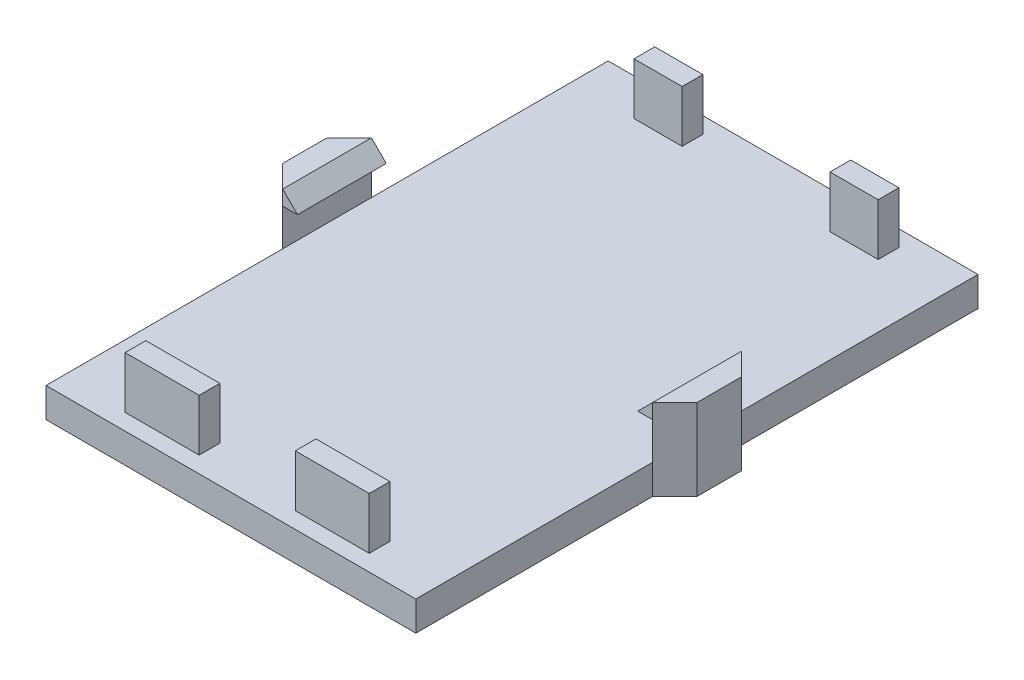
ISO-10303-21;
HEADER;
FILE_DESCRIPTION(('STEP AP214'),'2;1');
FILE_NAME('part.step','',(''),(''),'','','');
FILE_SCHEMA(('AUTOMOTIVE_DESIGN { 1 0 10303 214 1 1 1 1 }'));
ENDSEC;
DATA;
#1=APPLICATION_CONTEXT('core data for automotive mechanical design processes');
#2=APPLICATION_PROTOCOL_DEFINITION('international standard','automotive_design',2000,#1);
#3=PRODUCT_CONTEXT('',#1,'mechanical');
#4=PRODUCT('Part','Part','',(#3));
#5=PRODUCT_RELATED_PRODUCT_CATEGORY('part','',(#4));
#6=PRODUCT_DEFINITION_FORMATION('','',#4);
#7=PRODUCT_DEFINITION_CONTEXT('part definition',#1,'design');
#8=PRODUCT_DEFINITION('design','',#6,#7);
#9=PRODUCT_DEFINITION_SHAPE('','',#8);
#10=(LENGTH_UNIT() NAMED_UNIT(*) SI_UNIT(.MILLI.,.METRE.));
#11=(NAMED_UNIT(*) PLANE_ANGLE_UNIT() SI_UNIT($,.RADIAN.));
#12=(NAMED_UNIT(*) SI_UNIT($,.STERADIAN.) SOLID_ANGLE_UNIT());
#13=UNCERTAINTY_MEASURE_WITH_UNIT(LENGTH_MEASURE(1.E-05),#10,'distance_accuracy_value','');
#14=(GEOMETRIC_REPRESENTATION_CONTEXT(3) GLOBAL_UNCERTAINTY_ASSIGNED_CONTEXT((#13)) GLOBAL_UNIT_ASSIGNED_CONTEXT((#10,
#11,#12)) REPRESENTATION_CONTEXT('',''));
#15=CARTESIAN_POINT('',(0.,0.,0.));
#16=DIRECTION('',(0.,0.,1.));
#17=DIRECTION('',(1.,0.,0.));
#18=AXIS2_PLACEMENT_3D('',#15,#16,#17);
#19=CARTESIAN_POINT('',(0.,5.5,-16.5));
#20=DIRECTION('',(0.,0.,-1.));
#21=DIRECTION('',(-1.,0.,0.));
#22=AXIS2_PLACEMENT_3D('',#19,#20,#21);
#23=PLANE('',#22);
#24=DIRECTION('',(0.,-1.,0.));
#25=VECTOR('',#24,1.);
#26=CARTESIAN_POINT('',(5.,15.5975244490915,-16.5));
#27=LINE('',#26,#25);
#28=CARTESIAN_POINT('',(5.,5.5,-16.5));
#29=VERTEX_POINT('',#28);
#30=CARTESIAN_POINT('',(5.,2.,-16.5));
#31=VERTEX_POINT('',#30);
#32=EDGE_CURVE('E1060',#29,#31,#27,.T.);
#33=ORIENTED_EDGE('',*,*,#32,.T.);
#34=DIRECTION('',(1.,0.,0.));
#35=VECTOR('',#34,1.);
#36=CARTESIAN_POINT('',(0.,2.,-16.5));
#37=LINE('',#36,#35);
#38=CARTESIAN_POINT('',(8.25,2.,-16.5));
#39=VERTEX_POINT('',#38);
#40=EDGE_CURVE('E443',#31,#39,#37,.T.);
#41=ORIENTED_EDGE('',*,*,#40,.T.);
#42=DIRECTION('',(0.,-1.,0.));
#43=VECTOR('',#42,1.);
#44=CARTESIAN_POINT('',(8.25,5.5,-16.5));
#45=LINE('',#44,#43);
#46=CARTESIAN_POINT('',(8.25,5.5,-16.5));
#47=VERTEX_POINT('',#46);
#48=EDGE_CURVE('E351',#47,#39,#45,.T.);
#49=ORIENTED_EDGE('',*,*,#48,.F.);
#50=DIRECTION('',(1.,0.,0.));
#51=VECTOR('',#50,1.);
#52=CARTESIAN_POINT('',(0.,5.5,-16.5));
#53=LINE('',#52,#51);
#54=EDGE_CURVE('E322',#29,#47,#53,.T.);
#55=ORIENTED_EDGE('',*,*,#54,.F.);
#56=EDGE_LOOP('',(#33,#41,#49,#55));
#57=FACE_BOUND('',#56,.T.);
#58=ADVANCED_FACE('F46',(#57),#23,.F.);
#59=DIRECTION('',(0.,-1.,0.));
#60=VECTOR('',#59,1.);
#61=CARTESIAN_POINT('',(-5.,15.5975244490915,-16.5));
#62=LINE('',#61,#60);
#63=CARTESIAN_POINT('',(-5.,5.5,-16.5));
#64=VERTEX_POINT('',#63);
#65=CARTESIAN_POINT('',(-5.,2.,-16.5));
#66=VERTEX_POINT('',#65);
#67=EDGE_CURVE('E1013',#64,#66,#62,.T.);
#68=ORIENTED_EDGE('',*,*,#67,.F.);
#69=CARTESIAN_POINT('',(-8.25,5.5,-16.5));
#70=VERTEX_POINT('',#69);
#71=EDGE_CURVE('E323',#70,#64,#53,.T.);
#72=ORIENTED_EDGE('',*,*,#71,.F.);
#73=DIRECTION('',(0.,-1.,0.));
#74=VECTOR('',#73,1.);
#75=CARTESIAN_POINT('',(-8.25,5.5,-16.5));
#76=LINE('',#75,#74);
#77=CARTESIAN_POINT('',(-8.25,2.,-16.5));
#78=VERTEX_POINT('',#77);
#79=EDGE_CURVE('E340',#70,#78,#76,.T.);
#80=ORIENTED_EDGE('',*,*,#79,.T.);
#81=EDGE_CURVE('E445',#78,#66,#37,.T.);
#82=ORIENTED_EDGE('',*,*,#81,.T.);
#83=EDGE_LOOP('',(#68,#72,#80,#82));
#84=FACE_BOUND('',#83,.T.);
#85=ADVANCED_FACE('F700',(#84),#23,.F.);
#86=CARTESIAN_POINT('',(0.,5.5,-17.9));
#87=DIRECTION('',(0.,0.,-1.));
#88=DIRECTION('',(-1.,0.,0.));
#89=AXIS2_PLACEMENT_3D('',#86,#87,#88);
#90=PLANE('',#89);
#91=DIRECTION('',(1.,0.,0.));
#92=VECTOR('',#91,1.);
#93=CARTESIAN_POINT('',(0.,2.,-17.9));
#94=LINE('',#93,#92);
#95=CARTESIAN_POINT('',(5.,2.,-17.9));
#96=VERTEX_POINT('',#95);
#97=CARTESIAN_POINT('',(8.25,2.,-17.9));
#98=VERTEX_POINT('',#97);
#99=EDGE_CURVE('E453',#96,#98,#94,.T.);
#100=ORIENTED_EDGE('',*,*,#99,.F.);
#101=DIRECTION('',(0.,-1.,0.));
#102=VECTOR('',#101,1.);
#103=CARTESIAN_POINT('',(5.,15.5975244490915,-17.9));
#104=LINE('',#103,#102);
#105=CARTESIAN_POINT('',(5.,5.5,-17.9));
#106=VERTEX_POINT('',#105);
#107=EDGE_CURVE('E1030',#106,#96,#104,.T.);
#108=ORIENTED_EDGE('',*,*,#107,.F.);
#109=DIRECTION('',(1.,0.,0.));
#110=VECTOR('',#109,1.);
#111=CARTESIAN_POINT('',(0.,5.5,-17.9));
#112=LINE('',#111,#110);
#113=CARTESIAN_POINT('',(8.25,5.5,-17.9));
#114=VERTEX_POINT('',#113);
#115=EDGE_CURVE('E331',#106,#114,#112,.T.);
#116=ORIENTED_EDGE('',*,*,#115,.T.);
#117=DIRECTION('',(0.,-1.,0.));
#118=VECTOR('',#117,1.);
#119=CARTESIAN_POINT('',(8.25,5.5,-17.9));
#120=LINE('',#119,#118);
#121=EDGE_CURVE('E347',#114,#98,#120,.T.);
#122=ORIENTED_EDGE('',*,*,#121,.T.);
#123=EDGE_LOOP('',(#100,#108,#116,#122));
#124=FACE_BOUND('',#123,.T.);
#125=ADVANCED_FACE('F707',(#124),#90,.T.);
#126=CARTESIAN_POINT('',(-8.25,5.5,-17.9));
#127=VERTEX_POINT('',#126);
#128=CARTESIAN_POINT('',(-5.,5.5,-17.9));
#129=VERTEX_POINT('',#128);
#130=EDGE_CURVE('E332',#127,#129,#112,.T.);
#131=ORIENTED_EDGE('',*,*,#130,.T.);
#132=DIRECTION('',(0.,-1.,0.));
#133=VECTOR('',#132,1.);
#134=CARTESIAN_POINT('',(-5.,15.5975244490915,-17.9));
#135=LINE('',#134,#133);
#136=CARTESIAN_POINT('',(-5.,2.,-17.9));
#137=VERTEX_POINT('',#136);
#138=EDGE_CURVE('E66',#129,#137,#135,.T.);
#139=ORIENTED_EDGE('',*,*,#138,.T.);
#140=CARTESIAN_POINT('',(-8.25,2.,-17.9));
#141=VERTEX_POINT('',#140);
#142=EDGE_CURVE('E454',#141,#137,#94,.T.);
#143=ORIENTED_EDGE('',*,*,#142,.F.);
#144=DIRECTION('',(0.,-1.,0.));
#145=VECTOR('',#144,1.);
#146=CARTESIAN_POINT('',(-8.25,5.5,-17.9));
#147=LINE('',#146,#145);
#148=EDGE_CURVE('E344',#127,#141,#147,.T.);
#149=ORIENTED_EDGE('',*,*,#148,.F.);
#150=EDGE_LOOP('',(#131,#139,#143,#149));
#151=FACE_BOUND('',#150,.T.);
#152=ADVANCED_FACE('F941',(#151),#90,.T.);
#153=CARTESIAN_POINT('',(0.,5.5,0.));
#154=DIRECTION('',(0.,1.,0.));
#155=DIRECTION('',(0.,0.,1.));
#156=AXIS2_PLACEMENT_3D('',#153,#154,#155);
#157=PLANE('',#156);
#158=ORIENTED_EDGE('',*,*,#115,.F.);
#159=DIRECTION('',(0.,0.,-1.));
#160=VECTOR('',#159,1.);
#161=CARTESIAN_POINT('',(5.,5.5,-16.5));
#162=LINE('',#161,#160);
#163=EDGE_CURVE('E1017',#29,#106,#162,.T.);
#164=ORIENTED_EDGE('',*,*,#163,.F.);
#165=ORIENTED_EDGE('',*,*,#54,.T.);
#166=DIRECTION('',(0.,0.,-1.));
#167=VECTOR('',#166,1.);
#168=CARTESIAN_POINT('',(8.25,5.5,0.));
#169=LINE('',#168,#167);
#170=EDGE_CURVE('E327',#47,#114,#169,.T.);
#171=ORIENTED_EDGE('',*,*,#170,.T.);
#172=EDGE_LOOP('',(#158,#164,#165,#171));
#173=FACE_BOUND('',#172,.T.);
#174=ADVANCED_FACE('F932',(#173),#157,.T.);
#175=ORIENTED_EDGE('',*,*,#71,.T.);
#176=DIRECTION('',(0.,0.,1.));
#177=VECTOR('',#176,1.);
#178=CARTESIAN_POINT('',(-5.,5.5,-16.5));
#179=LINE('',#178,#177);
#180=EDGE_CURVE('E1011',#129,#64,#179,.T.);
#181=ORIENTED_EDGE('',*,*,#180,.F.);
#182=ORIENTED_EDGE('',*,*,#130,.F.);
#183=DIRECTION('',(0.,0.,-1.));
#184=VECTOR('',#183,1.);
#185=CARTESIAN_POINT('',(-8.25,5.5,0.));
#186=LINE('',#185,#184);
#187=EDGE_CURVE('E336',#70,#127,#186,.T.);
#188=ORIENTED_EDGE('',*,*,#187,.F.);
#189=EDGE_LOOP('',(#175,#181,#182,#188));
#190=FACE_BOUND('',#189,.T.);
#191=ADVANCED_FACE('F925',(#190),#157,.T.);
#192=CARTESIAN_POINT('',(0.,5.5,16.5));
#193=DIRECTION('',(0.,0.,-1.));
#194=DIRECTION('',(-1.,0.,0.));
#195=AXIS2_PLACEMENT_3D('',#192,#193,#194);
#196=PLANE('',#195);
#197=DIRECTION('',(1.,0.,0.));
#198=VECTOR('',#197,1.);
#199=CARTESIAN_POINT('',(0.,2.,16.5));
#200=LINE('',#199,#198);
#201=CARTESIAN_POINT('',(3.25,2.,16.5));
#202=VERTEX_POINT('',#201);
#203=CARTESIAN_POINT('',(8.25,2.,16.5));
#204=VERTEX_POINT('',#203);
#205=EDGE_CURVE('E481',#202,#204,#200,.T.);
#206=ORIENTED_EDGE('',*,*,#205,.F.);
#207=DIRECTION('',(0.,-1.,0.));
#208=VECTOR('',#207,1.);
#209=CARTESIAN_POINT('',(3.25,15.5975244490915,16.5));
#210=LINE('',#209,#208);
#211=CARTESIAN_POINT('',(3.25,5.5,16.5));
#212=VERTEX_POINT('',#211);
#213=EDGE_CURVE('E616',#212,#202,#210,.T.);
#214=ORIENTED_EDGE('',*,*,#213,.F.);
#215=DIRECTION('',(1.,0.,0.));
#216=VECTOR('',#215,1.);
#217=CARTESIAN_POINT('',(0.,5.5,16.5));
#218=LINE('',#217,#216);
#219=CARTESIAN_POINT('',(8.25,5.5,16.5));
#220=VERTEX_POINT('',#219);
#221=EDGE_CURVE('E603',#212,#220,#218,.T.);
#222=ORIENTED_EDGE('',*,*,#221,.T.);
#223=DIRECTION('',(0.,-1.,0.));
#224=VECTOR('',#223,1.);
#225=CARTESIAN_POINT('',(8.25,5.5,16.5));
#226=LINE('',#225,#224);
#227=EDGE_CURVE('E303',#220,#204,#226,.T.);
#228=ORIENTED_EDGE('',*,*,#227,.T.);
#229=EDGE_LOOP('',(#206,#214,#222,#228));
#230=FACE_BOUND('',#229,.T.);
#231=ADVANCED_FACE('F615',(#230),#196,.T.);
#232=CARTESIAN_POINT('',(-8.25,5.5,16.5));
#233=VERTEX_POINT('',#232);
#234=CARTESIAN_POINT('',(-3.25,5.5,16.5));
#235=VERTEX_POINT('',#234);
#236=EDGE_CURVE('E605',#233,#235,#218,.T.);
#237=ORIENTED_EDGE('',*,*,#236,.T.);
#238=DIRECTION('',(0.,-1.,0.));
#239=VECTOR('',#238,1.);
#240=CARTESIAN_POINT('',(-3.25,15.5975244490915,16.5));
#241=LINE('',#240,#239);
#242=CARTESIAN_POINT('',(-3.25,2.,16.5));
#243=VERTEX_POINT('',#242);
#244=EDGE_CURVE('E74',#235,#243,#241,.T.);
#245=ORIENTED_EDGE('',*,*,#244,.T.);
#246=CARTESIAN_POINT('',(-8.25,2.,16.5));
#247=VERTEX_POINT('',#246);
#248=EDGE_CURVE('E482',#247,#243,#200,.T.);
#249=ORIENTED_EDGE('',*,*,#248,.F.);
#250=DIRECTION('',(0.,-1.,0.));
#251=VECTOR('',#250,1.);
#252=CARTESIAN_POINT('',(-8.25,5.5,16.5));
#253=LINE('',#252,#251);
#254=EDGE_CURVE('E318',#233,#247,#253,.T.);
#255=ORIENTED_EDGE('',*,*,#254,.F.);
#256=EDGE_LOOP('',(#237,#245,#249,#255));
#257=FACE_BOUND('',#256,.T.);
#258=ADVANCED_FACE('F911',(#257),#196,.T.);
#259=CARTESIAN_POINT('',(0.,5.5,17.9));
#260=DIRECTION('',(0.,0.,-1.));
#261=DIRECTION('',(-1.,0.,0.));
#262=AXIS2_PLACEMENT_3D('',#259,#260,#261);
#263=PLANE('',#262);
#264=DIRECTION('',(0.,-1.,0.));
#265=VECTOR('',#264,1.);
#266=CARTESIAN_POINT('',(3.25,15.5975244490915,17.9));
#267=LINE('',#266,#265);
#268=CARTESIAN_POINT('',(3.25,5.5,17.9));
#269=VERTEX_POINT('',#268);
#270=CARTESIAN_POINT('',(3.25,2.,17.9));
#271=VERTEX_POINT('',#270);
#272=EDGE_CURVE('E1057',#269,#271,#267,.T.);
#273=ORIENTED_EDGE('',*,*,#272,.T.);
#274=DIRECTION('',(1.,0.,0.));
#275=VECTOR('',#274,1.);
#276=CARTESIAN_POINT('',(0.,2.,17.9));
#277=LINE('',#276,#275);
#278=CARTESIAN_POINT('',(8.25,2.,17.9));
#279=VERTEX_POINT('',#278);
#280=EDGE_CURVE('E490',#271,#279,#277,.T.);
#281=ORIENTED_EDGE('',*,*,#280,.T.);
#282=DIRECTION('',(0.,-1.,0.));
#283=VECTOR('',#282,1.);
#284=CARTESIAN_POINT('',(8.25,5.5,17.9));
#285=LINE('',#284,#283);
#286=CARTESIAN_POINT('',(8.25,5.5,17.9));
#287=VERTEX_POINT('',#286);
#288=EDGE_CURVE('E311',#287,#279,#285,.T.);
#289=ORIENTED_EDGE('',*,*,#288,.F.);
#290=DIRECTION('',(1.,0.,0.));
#291=VECTOR('',#290,1.);
#292=CARTESIAN_POINT('',(0.,5.5,17.9));
#293=LINE('',#292,#291);
#294=EDGE_CURVE('E298',#269,#287,#293,.T.);
#295=ORIENTED_EDGE('',*,*,#294,.F.);
#296=EDGE_LOOP('',(#273,#281,#289,#295));
#297=FACE_BOUND('',#296,.T.);
#298=ADVANCED_FACE('F628',(#297),#263,.F.);
#299=DIRECTION('',(0.,-1.,0.));
#300=VECTOR('',#299,1.);
#301=CARTESIAN_POINT('',(-3.25,15.5975244490915,17.9));
#302=LINE('',#301,#300);
#303=CARTESIAN_POINT('',(-3.25,5.5,17.9));
#304=VERTEX_POINT('',#303);
#305=CARTESIAN_POINT('',(-3.25,2.,17.9));
#306=VERTEX_POINT('',#305);
#307=EDGE_CURVE('E271',#304,#306,#302,.T.);
#308=ORIENTED_EDGE('',*,*,#307,.F.);
#309=CARTESIAN_POINT('',(-8.25,5.5,17.9));
#310=VERTEX_POINT('',#309);
#311=EDGE_CURVE('E286',#310,#304,#293,.T.);
#312=ORIENTED_EDGE('',*,*,#311,.F.);
#313=DIRECTION('',(0.,-1.,0.));
#314=VECTOR('',#313,1.);
#315=CARTESIAN_POINT('',(-8.25,5.5,17.9));
#316=LINE('',#315,#314);
#317=CARTESIAN_POINT('',(-8.25,2.,17.9));
#318=VERTEX_POINT('',#317);
#319=EDGE_CURVE('E315',#310,#318,#316,.T.);
#320=ORIENTED_EDGE('',*,*,#319,.T.);
#321=EDGE_CURVE('E288',#318,#306,#277,.T.);
#322=ORIENTED_EDGE('',*,*,#321,.T.);
#323=EDGE_LOOP('',(#308,#312,#320,#322));
#324=FACE_BOUND('',#323,.T.);
#325=ADVANCED_FACE('F284',(#324),#263,.F.);
#326=CARTESIAN_POINT('',(0.,5.5,0.));
#327=DIRECTION('',(0.,1.,0.));
#328=DIRECTION('',(0.,0.,1.));
#329=AXIS2_PLACEMENT_3D('',#326,#327,#328);
#330=PLANE('',#329);
#331=ORIENTED_EDGE('',*,*,#221,.F.);
#332=DIRECTION('',(0.,0.,-1.));
#333=VECTOR('',#332,1.);
#334=CARTESIAN_POINT('',(3.25,5.5,17.9));
#335=LINE('',#334,#333);
#336=EDGE_CURVE('E279',#269,#212,#335,.T.);
#337=ORIENTED_EDGE('',*,*,#336,.F.);
#338=ORIENTED_EDGE('',*,*,#294,.T.);
#339=DIRECTION('',(0.,0.,1.));
#340=VECTOR('',#339,1.);
#341=CARTESIAN_POINT('',(8.25,5.5,0.));
#342=LINE('',#341,#340);
#343=EDGE_CURVE('E297',#220,#287,#342,.T.);
#344=ORIENTED_EDGE('',*,*,#343,.F.);
#345=EDGE_LOOP('',(#331,#337,#338,#344));
#346=FACE_BOUND('',#345,.T.);
#347=ADVANCED_FACE('F623',(#346),#330,.T.);
#348=ORIENTED_EDGE('',*,*,#311,.T.);
#349=DIRECTION('',(0.,0.,1.));
#350=VECTOR('',#349,1.);
#351=CARTESIAN_POINT('',(-3.25,5.5,17.9));
#352=LINE('',#351,#350);
#353=EDGE_CURVE('E268',#235,#304,#352,.T.);
#354=ORIENTED_EDGE('',*,*,#353,.F.);
#355=ORIENTED_EDGE('',*,*,#236,.F.);
#356=DIRECTION('',(0.,0.,1.));
#357=VECTOR('',#356,1.);
#358=CARTESIAN_POINT('',(-8.25,5.5,0.));
#359=LINE('',#358,#357);
#360=EDGE_CURVE('E294',#233,#310,#359,.T.);
#361=ORIENTED_EDGE('',*,*,#360,.T.);
#362=EDGE_LOOP('',(#348,#354,#355,#361));
#363=FACE_BOUND('',#362,.T.);
#364=ADVANCED_FACE('F292',(#363),#330,.T.);
#365=CARTESIAN_POINT('',(-12.5,5.5,0.));
#366=DIRECTION('',(-1.,0.,0.));
#367=DIRECTION('',(0.,0.,1.));
#368=AXIS2_PLACEMENT_3D('',#365,#366,#367);
#369=PLANE('',#368);
#370=DIRECTION('',(0.,0.,-1.));
#371=VECTOR('',#370,1.);
#372=CARTESIAN_POINT('',(-12.5,4.5,2.99999999999999));
#373=LINE('',#372,#371);
#374=CARTESIAN_POINT('',(-12.5,4.5,2.99999999999999));
#375=VERTEX_POINT('',#374);
#376=CARTESIAN_POINT('',(-12.5,4.5,-3.));
#377=VERTEX_POINT('',#376);
#378=EDGE_CURVE('E278',#375,#377,#373,.T.);
#379=ORIENTED_EDGE('',*,*,#378,.F.);
#380=DIRECTION('',(0.,-1.,0.));
#381=VECTOR('',#380,1.);
#382=CARTESIAN_POINT('',(-12.5,5.5,2.99999999999999));
#383=LINE('',#382,#381);
#384=CARTESIAN_POINT('',(-12.5,2.,2.99999999999999));
#385=VERTEX_POINT('',#384);
#386=EDGE_CURVE('E411',#375,#385,#383,.T.);
#387=ORIENTED_EDGE('',*,*,#386,.T.);
#388=DIRECTION('',(0.,0.,-1.));
#389=VECTOR('',#388,1.);
#390=CARTESIAN_POINT('',(-12.5,2.,0.));
#391=LINE('',#390,#389);
#392=CARTESIAN_POINT('',(-12.5,2.,-2.99999999999999));
#393=VERTEX_POINT('',#392);
#394=EDGE_CURVE('E478',#385,#393,#391,.T.);
#395=ORIENTED_EDGE('',*,*,#394,.T.);
#396=DIRECTION('',(0.,-1.,0.));
#397=VECTOR('',#396,1.);
#398=CARTESIAN_POINT('',(-12.5,5.5,-2.99999999999999));
#399=LINE('',#398,#397);
#400=EDGE_CURVE('E432',#377,#393,#399,.T.);
#401=ORIENTED_EDGE('',*,*,#400,.F.);
#402=EDGE_LOOP('',(#379,#387,#395,#401));
#403=FACE_BOUND('',#402,.T.);
#404=ADVANCED_FACE('F536',(#403),#369,.F.);
#405=CARTESIAN_POINT('',(12.5,5.5,0.));
#406=DIRECTION('',(-1.,0.,0.));
#407=DIRECTION('',(0.,0.,1.));
#408=AXIS2_PLACEMENT_3D('',#405,#406,#407);
#409=PLANE('',#408);
#410=DIRECTION('',(0.,-1.,0.));
#411=VECTOR('',#410,1.);
#412=CARTESIAN_POINT('',(12.5,5.5,2.99999999999999));
#413=LINE('',#412,#411);
#414=CARTESIAN_POINT('',(12.5,4.5,2.99999999999999));
#415=VERTEX_POINT('',#414);
#416=CARTESIAN_POINT('',(12.5,2.,2.99999999999999));
#417=VERTEX_POINT('',#416);
#418=EDGE_CURVE('E59',#415,#417,#413,.T.);
#419=ORIENTED_EDGE('',*,*,#418,.F.);
#420=DIRECTION('',(0.,0.,-1.));
#421=VECTOR('',#420,1.);
#422=CARTESIAN_POINT('',(12.5,4.5,2.99999999999999));
#423=LINE('',#422,#421);
#424=CARTESIAN_POINT('',(12.5,4.5,-3.));
#425=VERTEX_POINT('',#424);
#426=EDGE_CURVE('E593',#415,#425,#423,.T.);
#427=ORIENTED_EDGE('',*,*,#426,.T.);
#428=DIRECTION('',(0.,-1.,0.));
#429=VECTOR('',#428,1.);
#430=CARTESIAN_POINT('',(12.5,5.5,-3.));
#431=LINE('',#430,#429);
#432=CARTESIAN_POINT('',(12.5,2.,-3.));
#433=VERTEX_POINT('',#432);
#434=EDGE_CURVE('E372',#425,#433,#431,.T.);
#435=ORIENTED_EDGE('',*,*,#434,.T.);
#436=DIRECTION('',(0.,0.,-1.));
#437=VECTOR('',#436,1.);
#438=CARTESIAN_POINT('',(12.5,2.,0.));
#439=LINE('',#438,#437);
#440=EDGE_CURVE('E468',#417,#433,#439,.T.);
#441=ORIENTED_EDGE('',*,*,#440,.F.);
#442=EDGE_LOOP('',(#419,#427,#435,#441));
#443=FACE_BOUND('',#442,.T.);
#444=ADVANCED_FACE('F723',(#443),#409,.T.);
#445=CARTESIAN_POINT('',(12.5,2.,0.));
#446=DIRECTION('',(-1.,0.,0.));
#447=DIRECTION('',(0.,0.,1.));
#448=AXIS2_PLACEMENT_3D('',#445,#446,#447);
#449=PLANE('',#448);
#450=CARTESIAN_POINT('',(12.5,0.,2.99999999999999));
#451=VERTEX_POINT('',#450);
#452=EDGE_CURVE('E11',#417,#451,#413,.T.);
#453=ORIENTED_EDGE('',*,*,#452,.F.);
#454=CARTESIAN_POINT('',(12.5,2.,19.));
#455=VERTEX_POINT('',#454);
#456=EDGE_CURVE('E463',#455,#417,#439,.T.);
#457=ORIENTED_EDGE('',*,*,#456,.F.);
#458=DIRECTION('',(0.,-1.,0.));
#459=VECTOR('',#458,1.);
#460=CARTESIAN_POINT('',(12.5,2.,19.));
#461=LINE('',#460,#459);
#462=CARTESIAN_POINT('',(12.5,0.,19.));
#463=VERTEX_POINT('',#462);
#464=EDGE_CURVE('E50',#455,#463,#461,.T.);
#465=ORIENTED_EDGE('',*,*,#464,.T.);
#466=DIRECTION('',(0.,0.,-1.));
#467=VECTOR('',#466,1.);
#468=CARTESIAN_POINT('',(12.5,0.,0.));
#469=LINE('',#468,#467);
#470=EDGE_CURVE('E498',#463,#451,#469,.T.);
#471=ORIENTED_EDGE('',*,*,#470,.T.);
#472=EDGE_LOOP('',(#453,#457,#465,#471));
#473=FACE_BOUND('',#472,.T.);
#474=ADVANCED_FACE('F557',(#473),#449,.F.);
#475=CARTESIAN_POINT('',(-12.5,2.,0.));
#476=DIRECTION('',(-1.,0.,0.));
#477=DIRECTION('',(0.,0.,1.));
#478=AXIS2_PLACEMENT_3D('',#475,#476,#477);
#479=PLANE('',#478);
#480=CARTESIAN_POINT('',(-12.5,2.,19.));
#481=VERTEX_POINT('',#480);
#482=EDGE_CURVE('E473',#481,#385,#391,.T.);
#483=ORIENTED_EDGE('',*,*,#482,.T.);
#484=CARTESIAN_POINT('',(-12.5,0.,2.99999999999999));
#485=VERTEX_POINT('',#484);
#486=EDGE_CURVE('E425',#385,#485,#383,.T.);
#487=ORIENTED_EDGE('',*,*,#486,.T.);
#488=DIRECTION('',(0.,0.,-1.));
#489=VECTOR('',#488,1.);
#490=CARTESIAN_POINT('',(-12.5,0.,0.));
#491=LINE('',#490,#489);
#492=CARTESIAN_POINT('',(-12.5,0.,19.));
#493=VERTEX_POINT('',#492);
#494=EDGE_CURVE('E444',#493,#485,#491,.T.);
#495=ORIENTED_EDGE('',*,*,#494,.F.);
#496=DIRECTION('',(0.,-1.,0.));
#497=VECTOR('',#496,1.);
#498=CARTESIAN_POINT('',(-12.5,2.,19.));
#499=LINE('',#498,#497);
#500=EDGE_CURVE('E493',#481,#493,#499,.T.);
#501=ORIENTED_EDGE('',*,*,#500,.F.);
#502=EDGE_LOOP('',(#483,#487,#495,#501));
#503=FACE_BOUND('',#502,.T.);
#504=ADVANCED_FACE('F550',(#503),#479,.T.);
#505=CARTESIAN_POINT('',(0.,2.,19.));
#506=DIRECTION('',(0.,0.,-1.));
#507=DIRECTION('',(-1.,0.,0.));
#508=AXIS2_PLACEMENT_3D('',#505,#506,#507);
#509=PLANE('',#508);
#510=DIRECTION('',(1.,0.,0.));
#511=VECTOR('',#510,1.);
#512=CARTESIAN_POINT('',(0.,0.,19.));
#513=LINE('',#512,#511);
#514=EDGE_CURVE('E437',#493,#463,#513,.T.);
#515=ORIENTED_EDGE('',*,*,#514,.T.);
#516=ORIENTED_EDGE('',*,*,#464,.F.);
#517=DIRECTION('',(1.,0.,0.));
#518=VECTOR('',#517,1.);
#519=CARTESIAN_POINT('',(0.,2.,19.));
#520=LINE('',#519,#518);
#521=EDGE_CURVE('E458',#481,#455,#520,.T.);
#522=ORIENTED_EDGE('',*,*,#521,.F.);
#523=ORIENTED_EDGE('',*,*,#500,.T.);
#524=EDGE_LOOP('',(#515,#516,#522,#523));
#525=FACE_BOUND('',#524,.T.);
#526=ADVANCED_FACE('F48',(#525),#509,.F.);
#527=CARTESIAN_POINT('',(12.5,2.,-19.));
#528=VERTEX_POINT('',#527);
#529=EDGE_CURVE('E462',#433,#528,#439,.T.);
#530=ORIENTED_EDGE('',*,*,#529,.F.);
#531=CARTESIAN_POINT('',(12.5,0.,-3.));
#532=VERTEX_POINT('',#531);
#533=EDGE_CURVE('E56',#433,#532,#431,.T.);
#534=ORIENTED_EDGE('',*,*,#533,.T.);
#535=CARTESIAN_POINT('',(12.5,0.,-19.));
#536=VERTEX_POINT('',#535);
#537=EDGE_CURVE('E497',#532,#536,#469,.T.);
#538=ORIENTED_EDGE('',*,*,#537,.T.);
#539=DIRECTION('',(0.,-1.,0.));
#540=VECTOR('',#539,1.);
#541=CARTESIAN_POINT('',(12.5,2.,-19.));
#542=LINE('',#541,#540);
#543=EDGE_CURVE('E515',#528,#536,#542,.T.);
#544=ORIENTED_EDGE('',*,*,#543,.F.);
#545=EDGE_LOOP('',(#530,#534,#538,#544));
#546=FACE_BOUND('',#545,.T.);
#547=ADVANCED_FACE('F680',(#546),#449,.F.);
#548=CARTESIAN_POINT('',(0.,2.,-19.));
#549=DIRECTION('',(0.,0.,-1.));
#550=DIRECTION('',(-1.,0.,0.));
#551=AXIS2_PLACEMENT_3D('',#548,#549,#550);
#552=PLANE('',#551);
#553=DIRECTION('',(1.,0.,0.));
#554=VECTOR('',#553,1.);
#555=CARTESIAN_POINT('',(0.,0.,-19.));
#556=LINE('',#555,#554);
#557=CARTESIAN_POINT('',(-12.5,0.,-19.));
#558=VERTEX_POINT('',#557);
#559=EDGE_CURVE('E502',#558,#536,#556,.T.);
#560=ORIENTED_EDGE('',*,*,#559,.F.);
#561=DIRECTION('',(0.,-1.,0.));
#562=VECTOR('',#561,1.);
#563=CARTESIAN_POINT('',(-12.5,2.,-19.));
#564=LINE('',#563,#562);
#565=CARTESIAN_POINT('',(-12.5,2.,-19.));
#566=VERTEX_POINT('',#565);
#567=EDGE_CURVE('E512',#566,#558,#564,.T.);
#568=ORIENTED_EDGE('',*,*,#567,.F.);
#569=DIRECTION('',(1.,0.,0.));
#570=VECTOR('',#569,1.);
#571=CARTESIAN_POINT('',(0.,2.,-19.));
#572=LINE('',#571,#570);
#573=EDGE_CURVE('E467',#566,#528,#572,.T.);
#574=ORIENTED_EDGE('',*,*,#573,.T.);
#575=ORIENTED_EDGE('',*,*,#543,.T.);
#576=EDGE_LOOP('',(#560,#568,#574,#575));
#577=FACE_BOUND('',#576,.T.);
#578=ADVANCED_FACE('F683',(#577),#552,.T.);
#579=CARTESIAN_POINT('',(-12.5,0.,-2.99999999999999));
#580=VERTEX_POINT('',#579);
#581=EDGE_CURVE('E438',#393,#580,#399,.T.);
#582=ORIENTED_EDGE('',*,*,#581,.F.);
#583=EDGE_CURVE('E472',#393,#566,#391,.T.);
#584=ORIENTED_EDGE('',*,*,#583,.T.);
#585=ORIENTED_EDGE('',*,*,#567,.T.);
#586=EDGE_CURVE('E506',#580,#558,#491,.T.);
#587=ORIENTED_EDGE('',*,*,#586,.F.);
#588=EDGE_LOOP('',(#582,#584,#585,#587));
#589=FACE_BOUND('',#588,.T.);
#590=ADVANCED_FACE('F685',(#589),#479,.T.);
#591=CARTESIAN_POINT('',(0.,2.,0.));
#592=DIRECTION('',(0.,1.,0.));
#593=DIRECTION('',(0.,0.,1.));
#594=AXIS2_PLACEMENT_3D('',#591,#592,#593);
#595=PLANE('',#594);
#596=ORIENTED_EDGE('',*,*,#40,.F.);
#597=DIRECTION('',(0.,0.,-1.));
#598=VECTOR('',#597,1.);
#599=CARTESIAN_POINT('',(5.,2.,-16.5));
#600=LINE('',#599,#598);
#601=EDGE_CURVE('E1034',#31,#96,#600,.T.);
#602=ORIENTED_EDGE('',*,*,#601,.T.);
#603=ORIENTED_EDGE('',*,*,#99,.T.);
#604=DIRECTION('',(0.,0.,-1.));
#605=VECTOR('',#604,1.);
#606=CARTESIAN_POINT('',(8.25,2.,0.));
#607=LINE('',#606,#605);
#608=EDGE_CURVE('E439',#39,#98,#607,.T.);
#609=ORIENTED_EDGE('',*,*,#608,.F.);
#610=EDGE_LOOP('',(#596,#602,#603,#609));
#611=FACE_BOUND('',#610,.T.);
#612=ORIENTED_EDGE('',*,*,#248,.T.);
#613=DIRECTION('',(0.,0.,1.));
#614=VECTOR('',#613,1.);
#615=CARTESIAN_POINT('',(-3.25,2.,17.9));
#616=LINE('',#615,#614);
#617=EDGE_CURVE('E290',#243,#306,#616,.T.);
#618=ORIENTED_EDGE('',*,*,#617,.T.);
#619=ORIENTED_EDGE('',*,*,#321,.F.);
#620=DIRECTION('',(0.,0.,1.));
#621=VECTOR('',#620,1.);
#622=CARTESIAN_POINT('',(-8.25,2.,0.));
#623=LINE('',#622,#621);
#624=EDGE_CURVE('E477',#247,#318,#623,.T.);
#625=ORIENTED_EDGE('',*,*,#624,.F.);
#626=EDGE_LOOP('',(#612,#618,#619,#625));
#627=FACE_BOUND('',#626,.T.);
#628=DIRECTION('',(0.,0.,1.));
#629=VECTOR('',#628,1.);
#630=CARTESIAN_POINT('',(-5.,2.,-16.5));
#631=LINE('',#630,#629);
#632=EDGE_CURVE('E1023',#137,#66,#631,.T.);
#633=ORIENTED_EDGE('',*,*,#632,.T.);
#634=ORIENTED_EDGE('',*,*,#81,.F.);
#635=DIRECTION('',(0.,0.,-1.));
#636=VECTOR('',#635,1.);
#637=CARTESIAN_POINT('',(-8.25,2.,0.));
#638=LINE('',#637,#636);
#639=EDGE_CURVE('E449',#78,#141,#638,.T.);
#640=ORIENTED_EDGE('',*,*,#639,.T.);
#641=ORIENTED_EDGE('',*,*,#142,.T.);
#642=EDGE_LOOP('',(#633,#634,#640,#641));
#643=FACE_BOUND('',#642,.T.);
#644=ORIENTED_EDGE('',*,*,#521,.T.);
#645=ORIENTED_EDGE('',*,*,#456,.T.);
#646=ORIENTED_EDGE('',*,*,#440,.T.);
#647=ORIENTED_EDGE('',*,*,#529,.T.);
#648=ORIENTED_EDGE('',*,*,#573,.F.);
#649=ORIENTED_EDGE('',*,*,#583,.F.);
#650=ORIENTED_EDGE('',*,*,#394,.F.);
#651=ORIENTED_EDGE('',*,*,#482,.F.);
#652=EDGE_LOOP('',(#644,#645,#646,#647,#648,#649,#650,#651));
#653=FACE_BOUND('',#652,.T.);
#654=DIRECTION('',(0.,0.,-1.));
#655=VECTOR('',#654,1.);
#656=CARTESIAN_POINT('',(3.25,2.,17.9));
#657=LINE('',#656,#655);
#658=EDGE_CURVE('E631',#271,#202,#657,.T.);
#659=ORIENTED_EDGE('',*,*,#658,.T.);
#660=ORIENTED_EDGE('',*,*,#205,.T.);
#661=DIRECTION('',(0.,0.,1.));
#662=VECTOR('',#661,1.);
#663=CARTESIAN_POINT('',(8.25,2.,0.));
#664=LINE('',#663,#662);
#665=EDGE_CURVE('E486',#204,#279,#664,.T.);
#666=ORIENTED_EDGE('',*,*,#665,.T.);
#667=ORIENTED_EDGE('',*,*,#280,.F.);
#668=EDGE_LOOP('',(#659,#660,#666,#667));
#669=FACE_BOUND('',#668,.T.);
#670=ADVANCED_FACE('F546',(#611,#627,#643,#653,#669),#595,.T.);
#671=CARTESIAN_POINT('',(0.,0.,0.));
#672=DIRECTION('',(0.,1.,0.));
#673=DIRECTION('',(0.,0.,1.));
#674=AXIS2_PLACEMENT_3D('',#671,#672,#673);
#675=PLANE('',#674);
#676=ORIENTED_EDGE('',*,*,#514,.F.);
#677=ORIENTED_EDGE('',*,*,#494,.T.);
#678=DIRECTION('',(-0.707106781186544,0.,-0.707106781186551));
#679=VECTOR('',#678,1.);
#680=CARTESIAN_POINT('',(-7.75000000000006,0.,7.74999999999998));
#681=LINE('',#680,#679);
#682=CARTESIAN_POINT('',(-14.,0.,1.49999999999998));
#683=VERTEX_POINT('',#682);
#684=EDGE_CURVE('E401',#485,#683,#681,.T.);
#685=ORIENTED_EDGE('',*,*,#684,.T.);
#686=DIRECTION('',(0.,0.,1.));
#687=VECTOR('',#686,1.);
#688=CARTESIAN_POINT('',(-14.,0.,0.));
#689=LINE('',#688,#687);
#690=CARTESIAN_POINT('',(-14.,0.,-1.49999999999998));
#691=VERTEX_POINT('',#690);
#692=EDGE_CURVE('E414',#691,#683,#689,.T.);
#693=ORIENTED_EDGE('',*,*,#692,.F.);
#694=DIRECTION('',(-0.707106781186544,0.,0.707106781186551));
#695=VECTOR('',#694,1.);
#696=CARTESIAN_POINT('',(-7.75000000000007,0.,-7.74999999999998));
#697=LINE('',#696,#695);
#698=EDGE_CURVE('E395',#580,#691,#697,.T.);
#699=ORIENTED_EDGE('',*,*,#698,.F.);
#700=ORIENTED_EDGE('',*,*,#586,.T.);
#701=ORIENTED_EDGE('',*,*,#559,.T.);
#702=ORIENTED_EDGE('',*,*,#537,.F.);
#703=DIRECTION('',(0.707106781186544,0.,0.707106781186551));
#704=VECTOR('',#703,1.);
#705=CARTESIAN_POINT('',(7.75000000000007,0.,-7.74999999999998));
#706=LINE('',#705,#704);
#707=CARTESIAN_POINT('',(14.,0.,-1.49999999999998));
#708=VERTEX_POINT('',#707);
#709=EDGE_CURVE('E361',#532,#708,#706,.T.);
#710=ORIENTED_EDGE('',*,*,#709,.T.);
#711=DIRECTION('',(0.,0.,1.));
#712=VECTOR('',#711,1.);
#713=CARTESIAN_POINT('',(14.,0.,0.));
#714=LINE('',#713,#712);
#715=CARTESIAN_POINT('',(14.,0.,1.49999999999998));
#716=VERTEX_POINT('',#715);
#717=EDGE_CURVE('E376',#708,#716,#714,.T.);
#718=ORIENTED_EDGE('',*,*,#717,.T.);
#719=DIRECTION('',(0.707106781186544,0.,-0.707106781186551));
#720=VECTOR('',#719,1.);
#721=CARTESIAN_POINT('',(7.75000000000006,0.,7.74999999999998));
#722=LINE('',#721,#720);
#723=EDGE_CURVE('E355',#451,#716,#722,.T.);
#724=ORIENTED_EDGE('',*,*,#723,.F.);
#725=ORIENTED_EDGE('',*,*,#470,.F.);
#726=EDGE_LOOP('',(#676,#677,#685,#693,#699,#700,#701,#702,#710,#718,#724,#725));
#727=FACE_BOUND('',#726,.T.);
#728=ADVANCED_FACE('F563',(#727),#675,.F.);
#729=CARTESIAN_POINT('',(-7.75000000000007,5.5,-7.74999999999998));
#730=DIRECTION('',(0.707106781186551,0.,0.707106781186544));
#731=DIRECTION('',(0.707106781186544,0.,-0.707106781186551));
#732=AXIS2_PLACEMENT_3D('',#729,#730,#731);
#733=PLANE('',#732);
#734=ORIENTED_EDGE('',*,*,#698,.T.);
#735=DIRECTION('',(0.,-1.,0.));
#736=VECTOR('',#735,1.);
#737=CARTESIAN_POINT('',(-14.,5.5,-1.49999999999998));
#738=LINE('',#737,#736);
#739=CARTESIAN_POINT('',(-14.,5.5,-1.49999999999998));
#740=VERTEX_POINT('',#739);
#741=EDGE_CURVE('E428',#740,#691,#738,.T.);
#742=ORIENTED_EDGE('',*,*,#741,.F.);
#743=DIRECTION('',(-0.707106781186544,0.,0.707106781186551));
#744=VECTOR('',#743,1.);
#745=CARTESIAN_POINT('',(-7.75000000000007,5.5,-7.74999999999998));
#746=LINE('',#745,#744);
#747=CARTESIAN_POINT('',(-12.5,5.5,-2.99999999999999));
#748=VERTEX_POINT('',#747);
#749=EDGE_CURVE('E400',#748,#740,#746,.T.);
#750=ORIENTED_EDGE('',*,*,#749,.F.);
#751=EDGE_CURVE('E433',#748,#377,#399,.T.);
#752=ORIENTED_EDGE('',*,*,#751,.T.);
#753=ORIENTED_EDGE('',*,*,#400,.T.);
#754=ORIENTED_EDGE('',*,*,#581,.T.);
#755=EDGE_LOOP('',(#734,#742,#750,#752,#753,#754));
#756=FACE_BOUND('',#755,.T.);
#757=ADVANCED_FACE('F642',(#756),#733,.F.);
#758=CARTESIAN_POINT('',(-14.,5.5,0.));
#759=DIRECTION('',(1.,0.,0.));
#760=DIRECTION('',(0.,0.,-1.));
#761=AXIS2_PLACEMENT_3D('',#758,#759,#760);
#762=PLANE('',#761);
#763=ORIENTED_EDGE('',*,*,#692,.T.);
#764=DIRECTION('',(0.,-1.,0.));
#765=VECTOR('',#764,1.);
#766=CARTESIAN_POINT('',(-14.,5.5,1.49999999999998));
#767=LINE('',#766,#765);
#768=CARTESIAN_POINT('',(-14.,5.5,1.49999999999998));
#769=VERTEX_POINT('',#768);
#770=EDGE_CURVE('E424',#769,#683,#767,.T.);
#771=ORIENTED_EDGE('',*,*,#770,.F.);
#772=DIRECTION('',(0.,0.,1.));
#773=VECTOR('',#772,1.);
#774=CARTESIAN_POINT('',(-14.,5.5,0.));
#775=LINE('',#774,#773);
#776=EDGE_CURVE('E404',#740,#769,#775,.T.);
#777=ORIENTED_EDGE('',*,*,#776,.F.);
#778=ORIENTED_EDGE('',*,*,#741,.T.);
#779=EDGE_LOOP('',(#763,#771,#777,#778));
#780=FACE_BOUND('',#779,.T.);
#781=ADVANCED_FACE('F731',(#780),#762,.F.);
#782=CARTESIAN_POINT('',(-7.75000000000006,5.5,7.74999999999998));
#783=DIRECTION('',(-0.707106781186551,0.,0.707106781186544));
#784=DIRECTION('',(0.707106781186544,0.,0.707106781186551));
#785=AXIS2_PLACEMENT_3D('',#782,#783,#784);
#786=PLANE('',#785);
#787=ORIENTED_EDGE('',*,*,#684,.F.);
#788=ORIENTED_EDGE('',*,*,#486,.F.);
#789=ORIENTED_EDGE('',*,*,#386,.F.);
#790=CARTESIAN_POINT('',(-12.5,5.5,2.99999999999999));
#791=VERTEX_POINT('',#790);
#792=EDGE_CURVE('E421',#791,#375,#383,.T.);
#793=ORIENTED_EDGE('',*,*,#792,.F.);
#794=DIRECTION('',(-0.707106781186544,0.,-0.707106781186551));
#795=VECTOR('',#794,1.);
#796=CARTESIAN_POINT('',(-7.75000000000006,5.5,7.74999999999998));
#797=LINE('',#796,#795);
#798=EDGE_CURVE('E407',#791,#769,#797,.T.);
#799=ORIENTED_EDGE('',*,*,#798,.T.);
#800=ORIENTED_EDGE('',*,*,#770,.T.);
#801=EDGE_LOOP('',(#787,#788,#789,#793,#799,#800));
#802=FACE_BOUND('',#801,.T.);
#803=ADVANCED_FACE('F542',(#802),#786,.T.);
#804=CARTESIAN_POINT('',(0.,5.5,0.));
#805=DIRECTION('',(0.,1.,0.));
#806=DIRECTION('',(0.,0.,1.));
#807=AXIS2_PLACEMENT_3D('',#804,#805,#806);
#808=PLANE('',#807);
#809=DIRECTION('',(0.,0.,-1.));
#810=VECTOR('',#809,1.);
#811=CARTESIAN_POINT('',(-12.5,5.5,0.));
#812=LINE('',#811,#810);
#813=EDGE_CURVE('E396',#791,#748,#812,.T.);
#814=ORIENTED_EDGE('',*,*,#813,.T.);
#815=ORIENTED_EDGE('',*,*,#749,.T.);
#816=ORIENTED_EDGE('',*,*,#776,.T.);
#817=ORIENTED_EDGE('',*,*,#798,.F.);
#818=EDGE_LOOP('',(#814,#815,#816,#817));
#819=FACE_BOUND('',#818,.T.);
#820=ADVANCED_FACE('F722',(#819),#808,.T.);
#821=CARTESIAN_POINT('',(7.75000000000006,5.5,7.74999999999998));
#822=DIRECTION('',(-0.707106781186551,0.,-0.707106781186544));
#823=DIRECTION('',(-0.707106781186544,0.,0.707106781186551));
#824=AXIS2_PLACEMENT_3D('',#821,#822,#823);
#825=PLANE('',#824);
#826=ORIENTED_EDGE('',*,*,#723,.T.);
#827=DIRECTION('',(0.,-1.,0.));
#828=VECTOR('',#827,1.);
#829=CARTESIAN_POINT('',(14.,5.5,1.49999999999998));
#830=LINE('',#829,#828);
#831=CARTESIAN_POINT('',(14.,5.5,1.49999999999998));
#832=VERTEX_POINT('',#831);
#833=EDGE_CURVE('E390',#832,#716,#830,.T.);
#834=ORIENTED_EDGE('',*,*,#833,.F.);
#835=DIRECTION('',(0.707106781186544,0.,-0.707106781186551));
#836=VECTOR('',#835,1.);
#837=CARTESIAN_POINT('',(7.75000000000006,5.5,7.74999999999998));
#838=LINE('',#837,#836);
#839=CARTESIAN_POINT('',(12.5,5.5,2.99999999999999));
#840=VERTEX_POINT('',#839);
#841=EDGE_CURVE('E360',#840,#832,#838,.T.);
#842=ORIENTED_EDGE('',*,*,#841,.F.);
#843=EDGE_CURVE('E58',#840,#415,#413,.T.);
#844=ORIENTED_EDGE('',*,*,#843,.T.);
#845=ORIENTED_EDGE('',*,*,#418,.T.);
#846=ORIENTED_EDGE('',*,*,#452,.T.);
#847=EDGE_LOOP('',(#826,#834,#842,#844,#845,#846));
#848=FACE_BOUND('',#847,.T.);
#849=ADVANCED_FACE('F560',(#848),#825,.F.);
#850=CARTESIAN_POINT('',(14.,5.5,0.));
#851=DIRECTION('',(1.,0.,0.));
#852=DIRECTION('',(0.,0.,-1.));
#853=AXIS2_PLACEMENT_3D('',#850,#851,#852);
#854=PLANE('',#853);
#855=ORIENTED_EDGE('',*,*,#717,.F.);
#856=DIRECTION('',(0.,-1.,0.));
#857=VECTOR('',#856,1.);
#858=CARTESIAN_POINT('',(14.,5.5,-1.49999999999998));
#859=LINE('',#858,#857);
#860=CARTESIAN_POINT('',(14.,5.5,-1.49999999999998));
#861=VERTEX_POINT('',#860);
#862=EDGE_CURVE('E387',#861,#708,#859,.T.);
#863=ORIENTED_EDGE('',*,*,#862,.F.);
#864=DIRECTION('',(0.,0.,1.));
#865=VECTOR('',#864,1.);
#866=CARTESIAN_POINT('',(14.,5.5,0.));
#867=LINE('',#866,#865);
#868=EDGE_CURVE('E364',#861,#832,#867,.T.);
#869=ORIENTED_EDGE('',*,*,#868,.T.);
#870=ORIENTED_EDGE('',*,*,#833,.T.);
#871=EDGE_LOOP('',(#855,#863,#869,#870));
#872=FACE_BOUND('',#871,.T.);
#873=ADVANCED_FACE('F567',(#872),#854,.T.);
#874=CARTESIAN_POINT('',(7.75000000000007,5.5,-7.74999999999998));
#875=DIRECTION('',(0.707106781186551,0.,-0.707106781186544));
#876=DIRECTION('',(-0.707106781186544,0.,-0.707106781186551));
#877=AXIS2_PLACEMENT_3D('',#874,#875,#876);
#878=PLANE('',#877);
#879=ORIENTED_EDGE('',*,*,#709,.F.);
#880=ORIENTED_EDGE('',*,*,#533,.F.);
#881=ORIENTED_EDGE('',*,*,#434,.F.);
#882=CARTESIAN_POINT('',(12.5,5.5,-3.));
#883=VERTEX_POINT('',#882);
#884=EDGE_CURVE('E383',#883,#425,#431,.T.);
#885=ORIENTED_EDGE('',*,*,#884,.F.);
#886=DIRECTION('',(0.707106781186544,0.,0.707106781186551));
#887=VECTOR('',#886,1.);
#888=CARTESIAN_POINT('',(7.75000000000007,5.5,-7.74999999999998));
#889=LINE('',#888,#887);
#890=EDGE_CURVE('E368',#883,#861,#889,.T.);
#891=ORIENTED_EDGE('',*,*,#890,.T.);
#892=ORIENTED_EDGE('',*,*,#862,.T.);
#893=EDGE_LOOP('',(#879,#880,#881,#885,#891,#892));
#894=FACE_BOUND('',#893,.T.);
#895=ADVANCED_FACE('F673',(#894),#878,.T.);
#896=CARTESIAN_POINT('',(0.,5.5,0.));
#897=DIRECTION('',(0.,1.,0.));
#898=DIRECTION('',(0.,0.,1.));
#899=AXIS2_PLACEMENT_3D('',#896,#897,#898);
#900=PLANE('',#899);
#901=DIRECTION('',(0.,0.,-1.));
#902=VECTOR('',#901,1.);
#903=CARTESIAN_POINT('',(12.5,5.5,0.));
#904=LINE('',#903,#902);
#905=EDGE_CURVE('E356',#840,#883,#904,.T.);
#906=ORIENTED_EDGE('',*,*,#905,.F.);
#907=ORIENTED_EDGE('',*,*,#841,.T.);
#908=ORIENTED_EDGE('',*,*,#868,.F.);
#909=ORIENTED_EDGE('',*,*,#890,.F.);
#910=EDGE_LOOP('',(#906,#907,#908,#909));
#911=FACE_BOUND('',#910,.T.);
#912=ADVANCED_FACE('F574',(#911),#900,.T.);
#913=CARTESIAN_POINT('',(8.25,5.5,0.));
#914=DIRECTION('',(-1.,0.,0.));
#915=DIRECTION('',(0.,0.,1.));
#916=AXIS2_PLACEMENT_3D('',#913,#914,#915);
#917=PLANE('',#916);
#918=ORIENTED_EDGE('',*,*,#608,.T.);
#919=ORIENTED_EDGE('',*,*,#121,.F.);
#920=ORIENTED_EDGE('',*,*,#170,.F.);
#921=ORIENTED_EDGE('',*,*,#48,.T.);
#922=EDGE_LOOP('',(#918,#919,#920,#921));
#923=FACE_BOUND('',#922,.T.);
#924=ADVANCED_FACE('F712',(#923),#917,.F.);
#925=CARTESIAN_POINT('',(-8.25,5.5,0.));
#926=DIRECTION('',(-1.,0.,0.));
#927=DIRECTION('',(0.,0.,1.));
#928=AXIS2_PLACEMENT_3D('',#925,#926,#927);
#929=PLANE('',#928);
#930=ORIENTED_EDGE('',*,*,#148,.T.);
#931=ORIENTED_EDGE('',*,*,#639,.F.);
#932=ORIENTED_EDGE('',*,*,#79,.F.);
#933=ORIENTED_EDGE('',*,*,#187,.T.);
#934=EDGE_LOOP('',(#930,#931,#932,#933));
#935=FACE_BOUND('',#934,.T.);
#936=ADVANCED_FACE('F761',(#935),#929,.T.);
#937=CARTESIAN_POINT('',(-8.25,5.5,0.));
#938=DIRECTION('',(1.,0.,0.));
#939=DIRECTION('',(0.,0.,-1.));
#940=AXIS2_PLACEMENT_3D('',#937,#938,#939);
#941=PLANE('',#940);
#942=ORIENTED_EDGE('',*,*,#624,.T.);
#943=ORIENTED_EDGE('',*,*,#319,.F.);
#944=ORIENTED_EDGE('',*,*,#360,.F.);
#945=ORIENTED_EDGE('',*,*,#254,.T.);
#946=EDGE_LOOP('',(#942,#943,#944,#945));
#947=FACE_BOUND('',#946,.T.);
#948=ADVANCED_FACE('F770',(#947),#941,.F.);
#949=CARTESIAN_POINT('',(8.25,5.5,0.));
#950=DIRECTION('',(1.,0.,0.));
#951=DIRECTION('',(0.,0.,-1.));
#952=AXIS2_PLACEMENT_3D('',#949,#950,#951);
#953=PLANE('',#952);
#954=ORIENTED_EDGE('',*,*,#288,.T.);
#955=ORIENTED_EDGE('',*,*,#665,.F.);
#956=ORIENTED_EDGE('',*,*,#227,.F.);
#957=ORIENTED_EDGE('',*,*,#343,.T.);
#958=EDGE_LOOP('',(#954,#955,#956,#957));
#959=FACE_BOUND('',#958,.T.);
#960=ADVANCED_FACE('F622',(#959),#953,.T.);
#961=CARTESIAN_POINT('',(12.5,5.5,2.99999999999999));
#962=DIRECTION('',(0.707106781186547,-0.707106781186547,0.));
#963=DIRECTION('',(0.707106781186548,0.707106781186548,0.));
#964=AXIS2_PLACEMENT_3D('',#961,#962,#963);
#965=PLANE('',#964);
#966=ORIENTED_EDGE('',*,*,#905,.T.);
#967=DIRECTION('',(-0.707106781186548,-0.707106781186548,0.));
#968=VECTOR('',#967,1.);
#969=CARTESIAN_POINT('',(12.5,5.5,-3.));
#970=LINE('',#969,#968);
#971=CARTESIAN_POINT('',(11.5,4.5,-3.));
#972=VERTEX_POINT('',#971);
#973=EDGE_CURVE('E661',#883,#972,#970,.T.);
#974=ORIENTED_EDGE('',*,*,#973,.T.);
#975=DIRECTION('',(0.,0.,-1.));
#976=VECTOR('',#975,1.);
#977=CARTESIAN_POINT('',(11.5,4.5,2.99999999999999));
#978=LINE('',#977,#976);
#979=CARTESIAN_POINT('',(11.5,4.5,2.99999999999999));
#980=VERTEX_POINT('',#979);
#981=EDGE_CURVE('E582',#980,#972,#978,.T.);
#982=ORIENTED_EDGE('',*,*,#981,.F.);
#983=DIRECTION('',(-0.707106781186548,-0.707106781186548,0.));
#984=VECTOR('',#983,1.);
#985=CARTESIAN_POINT('',(12.5,5.5,2.99999999999999));
#986=LINE('',#985,#984);
#987=EDGE_CURVE('E580',#840,#980,#986,.T.);
#988=ORIENTED_EDGE('',*,*,#987,.F.);
#989=EDGE_LOOP('',(#966,#974,#982,#988));
#990=FACE_BOUND('',#989,.T.);
#991=ADVANCED_FACE('F581',(#990),#965,.F.);
#992=CARTESIAN_POINT('',(11.5,4.5,2.99999999999999));
#993=DIRECTION('',(0.,1.,0.));
#994=DIRECTION('',(0.,0.,1.));
#995=AXIS2_PLACEMENT_3D('',#992,#993,#994);
#996=PLANE('',#995);
#997=ORIENTED_EDGE('',*,*,#981,.T.);
#998=DIRECTION('',(1.,0.,0.));
#999=VECTOR('',#998,1.);
#1000=CARTESIAN_POINT('',(11.5,4.5,-3.));
#1001=LINE('',#1000,#999);
#1002=EDGE_CURVE('E587',#972,#425,#1001,.T.);
#1003=ORIENTED_EDGE('',*,*,#1002,.T.);
#1004=ORIENTED_EDGE('',*,*,#426,.F.);
#1005=DIRECTION('',(1.,0.,0.));
#1006=VECTOR('',#1005,1.);
#1007=CARTESIAN_POINT('',(11.5,4.5,2.99999999999999));
#1008=LINE('',#1007,#1006);
#1009=EDGE_CURVE('E586',#980,#415,#1008,.T.);
#1010=ORIENTED_EDGE('',*,*,#1009,.F.);
#1011=EDGE_LOOP('',(#997,#1003,#1004,#1010));
#1012=FACE_BOUND('',#1011,.T.);
#1013=ADVANCED_FACE('F596',(#1012),#996,.F.);
#1014=CARTESIAN_POINT('',(0.,0.,2.99999999999999));
#1015=DIRECTION('',(0.,0.,-1.));
#1016=DIRECTION('',(-1.,0.,0.));
#1017=AXIS2_PLACEMENT_3D('',#1014,#1015,#1016);
#1018=PLANE('',#1017);
#1019=ORIENTED_EDGE('',*,*,#843,.F.);
#1020=ORIENTED_EDGE('',*,*,#987,.T.);
#1021=ORIENTED_EDGE('',*,*,#1009,.T.);
#1022=EDGE_LOOP('',(#1019,#1020,#1021));
#1023=FACE_BOUND('',#1022,.T.);
#1024=ADVANCED_FACE('F589',(#1023),#1018,.F.);
#1025=CARTESIAN_POINT('',(0.,0.,-3.));
#1026=DIRECTION('',(0.,0.,-1.));
#1027=DIRECTION('',(-1.,0.,0.));
#1028=AXIS2_PLACEMENT_3D('',#1025,#1026,#1027);
#1029=PLANE('',#1028);
#1030=ORIENTED_EDGE('',*,*,#884,.T.);
#1031=ORIENTED_EDGE('',*,*,#1002,.F.);
#1032=ORIENTED_EDGE('',*,*,#973,.F.);
#1033=EDGE_LOOP('',(#1030,#1031,#1032));
#1034=FACE_BOUND('',#1033,.T.);
#1035=ADVANCED_FACE('F671',(#1034),#1029,.T.);
#1036=CARTESIAN_POINT('',(-12.5,5.5,2.99999999999999));
#1037=DIRECTION('',(-0.707106781186547,-0.707106781186547,0.));
#1038=DIRECTION('',(0.707106781186548,-0.707106781186548,0.));
#1039=AXIS2_PLACEMENT_3D('',#1036,#1037,#1038);
#1040=PLANE('',#1039);
#1041=DIRECTION('',(0.,0.,-1.));
#1042=VECTOR('',#1041,1.);
#1043=CARTESIAN_POINT('',(-11.5,4.5,2.99999999999999));
#1044=LINE('',#1043,#1042);
#1045=CARTESIAN_POINT('',(-11.5,4.5,2.99999999999999));
#1046=VERTEX_POINT('',#1045);
#1047=CARTESIAN_POINT('',(-11.5,4.5,-3.));
#1048=VERTEX_POINT('',#1047);
#1049=EDGE_CURVE('E1037',#1046,#1048,#1044,.T.);
#1050=ORIENTED_EDGE('',*,*,#1049,.T.);
#1051=DIRECTION('',(-0.707106781186548,0.707106781186548,0.));
#1052=VECTOR('',#1051,1.);
#1053=CARTESIAN_POINT('',(-12.5,5.5,-3.));
#1054=LINE('',#1053,#1052);
#1055=EDGE_CURVE('E651',#1048,#748,#1054,.T.);
#1056=ORIENTED_EDGE('',*,*,#1055,.T.);
#1057=ORIENTED_EDGE('',*,*,#813,.F.);
#1058=DIRECTION('',(-0.707106781186548,0.707106781186548,0.));
#1059=VECTOR('',#1058,1.);
#1060=CARTESIAN_POINT('',(-12.5,5.5,2.99999999999999));
#1061=LINE('',#1060,#1059);
#1062=EDGE_CURVE('E657',#1046,#791,#1061,.T.);
#1063=ORIENTED_EDGE('',*,*,#1062,.F.);
#1064=EDGE_LOOP('',(#1050,#1056,#1057,#1063));
#1065=FACE_BOUND('',#1064,.T.);
#1066=ADVANCED_FACE('F848',(#1065),#1040,.F.);
#1067=CARTESIAN_POINT('',(-11.5,4.5,2.99999999999999));
#1068=DIRECTION('',(0.,1.,0.));
#1069=DIRECTION('',(0.,0.,1.));
#1070=AXIS2_PLACEMENT_3D('',#1067,#1068,#1069);
#1071=PLANE('',#1070);
#1072=ORIENTED_EDGE('',*,*,#378,.T.);
#1073=DIRECTION('',(1.,0.,0.));
#1074=VECTOR('',#1073,1.);
#1075=CARTESIAN_POINT('',(-11.5,4.5,-3.));
#1076=LINE('',#1075,#1074);
#1077=EDGE_CURVE('E653',#377,#1048,#1076,.T.);
#1078=ORIENTED_EDGE('',*,*,#1077,.T.);
#1079=ORIENTED_EDGE('',*,*,#1049,.F.);
#1080=DIRECTION('',(1.,0.,0.));
#1081=VECTOR('',#1080,1.);
#1082=CARTESIAN_POINT('',(-11.5,4.5,2.99999999999999));
#1083=LINE('',#1082,#1081);
#1084=EDGE_CURVE('E663',#375,#1046,#1083,.T.);
#1085=ORIENTED_EDGE('',*,*,#1084,.F.);
#1086=EDGE_LOOP('',(#1072,#1078,#1079,#1085));
#1087=FACE_BOUND('',#1086,.T.);
#1088=ADVANCED_FACE('F856',(#1087),#1071,.F.);
#1089=CARTESIAN_POINT('',(0.,0.,2.99999999999999));
#1090=DIRECTION('',(0.,0.,-1.));
#1091=DIRECTION('',(-1.,0.,0.));
#1092=AXIS2_PLACEMENT_3D('',#1089,#1090,#1091);
#1093=PLANE('',#1092);
#1094=ORIENTED_EDGE('',*,*,#1062,.T.);
#1095=ORIENTED_EDGE('',*,*,#792,.T.);
#1096=ORIENTED_EDGE('',*,*,#1084,.T.);
#1097=EDGE_LOOP('',(#1094,#1095,#1096));
#1098=FACE_BOUND('',#1097,.T.);
#1099=ADVANCED_FACE('F865',(#1098),#1093,.F.);
#1100=CARTESIAN_POINT('',(0.,0.,-3.));
#1101=DIRECTION('',(0.,0.,-1.));
#1102=DIRECTION('',(-1.,0.,0.));
#1103=AXIS2_PLACEMENT_3D('',#1100,#1101,#1102);
#1104=PLANE('',#1103);
#1105=ORIENTED_EDGE('',*,*,#1055,.F.);
#1106=ORIENTED_EDGE('',*,*,#1077,.F.);
#1107=ORIENTED_EDGE('',*,*,#751,.F.);
#1108=EDGE_LOOP('',(#1105,#1106,#1107));
#1109=FACE_BOUND('',#1108,.T.);
#1110=ADVANCED_FACE('F650',(#1109),#1104,.T.);
#1111=CARTESIAN_POINT('',(3.25,15.5975244490915,17.9));
#1112=DIRECTION('',(-1.,0.,0.));
#1113=DIRECTION('',(0.,0.,1.));
#1114=AXIS2_PLACEMENT_3D('',#1111,#1112,#1113);
#1115=PLANE('',#1114);
#1116=ORIENTED_EDGE('',*,*,#336,.T.);
#1117=ORIENTED_EDGE('',*,*,#213,.T.);
#1118=ORIENTED_EDGE('',*,*,#658,.F.);
#1119=ORIENTED_EDGE('',*,*,#272,.F.);
#1120=EDGE_LOOP('',(#1116,#1117,#1118,#1119));
#1121=FACE_BOUND('',#1120,.T.);
#1122=ADVANCED_FACE('F879',(#1121),#1115,.T.);
#1123=CARTESIAN_POINT('',(-3.25,15.5975244490915,17.9));
#1124=DIRECTION('',(1.,0.,0.));
#1125=DIRECTION('',(0.,0.,-1.));
#1126=AXIS2_PLACEMENT_3D('',#1123,#1124,#1125);
#1127=PLANE('',#1126);
#1128=ORIENTED_EDGE('',*,*,#353,.T.);
#1129=ORIENTED_EDGE('',*,*,#307,.T.);
#1130=ORIENTED_EDGE('',*,*,#617,.F.);
#1131=ORIENTED_EDGE('',*,*,#244,.F.);
#1132=EDGE_LOOP('',(#1128,#1129,#1130,#1131));
#1133=FACE_BOUND('',#1132,.T.);
#1134=ADVANCED_FACE('F270',(#1133),#1127,.T.);
#1135=CARTESIAN_POINT('',(5.,15.5975244490915,-16.5));
#1136=DIRECTION('',(-1.,0.,0.));
#1137=DIRECTION('',(0.,0.,1.));
#1138=AXIS2_PLACEMENT_3D('',#1135,#1136,#1137);
#1139=PLANE('',#1138);
#1140=ORIENTED_EDGE('',*,*,#163,.T.);
#1141=ORIENTED_EDGE('',*,*,#107,.T.);
#1142=ORIENTED_EDGE('',*,*,#601,.F.);
#1143=ORIENTED_EDGE('',*,*,#32,.F.);
#1144=EDGE_LOOP('',(#1140,#1141,#1142,#1143));
#1145=FACE_BOUND('',#1144,.T.);
#1146=ADVANCED_FACE('F990',(#1145),#1139,.T.);
#1147=CARTESIAN_POINT('',(-5.,15.5975244490915,-16.5));
#1148=DIRECTION('',(1.,0.,0.));
#1149=DIRECTION('',(0.,0.,-1.));
#1150=AXIS2_PLACEMENT_3D('',#1147,#1148,#1149);
#1151=PLANE('',#1150);
#1152=ORIENTED_EDGE('',*,*,#180,.T.);
#1153=ORIENTED_EDGE('',*,*,#67,.T.);
#1154=ORIENTED_EDGE('',*,*,#632,.F.);
#1155=ORIENTED_EDGE('',*,*,#138,.F.);
#1156=EDGE_LOOP('',(#1152,#1153,#1154,#1155));
#1157=FACE_BOUND('',#1156,.T.);
#1158=ADVANCED_FACE('F999',(#1157),#1151,.T.);
#1159=CLOSED_SHELL('',(#58,#85,#125,#152,#174,#191,#231,#258,#298,#325,#347,#364,#404,#444,#474,
#504,#526,#547,#578,#590,#670,#728,#757,#781,#803,#820,#849,#873,#895,#912,#924,#936,#948,#960,
#991,#1013,#1024,#1035,#1066,#1088,#1099,#1110,#1122,#1134,#1146,#1158));
#1160=MANIFOLD_SOLID_BREP('B2',#1159);
#1161=ADVANCED_BREP_SHAPE_REPRESENTATION('',(#18,#1160),#14);
#1162=SHAPE_DEFINITION_REPRESENTATION(#9,#1161);
ENDSEC;
END-ISO-10303-21;
